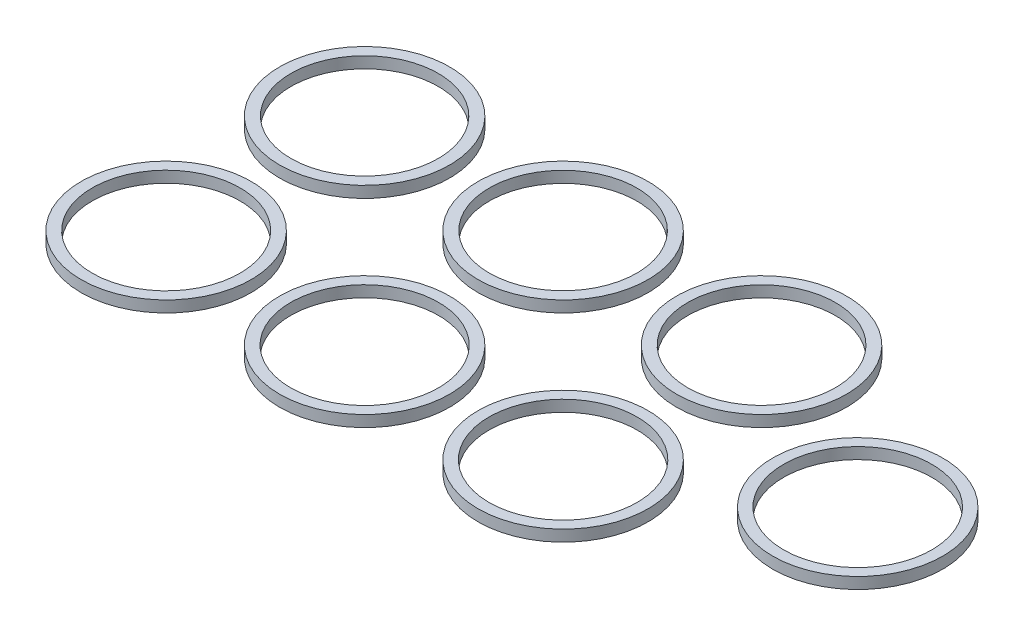
ISO-10303-21;
HEADER;
FILE_DESCRIPTION(('STEP AP214'),'2;1');
FILE_NAME('part.step','',(''),(''),'','','');
FILE_SCHEMA(('AUTOMOTIVE_DESIGN { 1 0 10303 214 1 1 1 1 }'));
ENDSEC;
DATA;
#1=APPLICATION_CONTEXT('core data for automotive mechanical design processes');
#2=APPLICATION_PROTOCOL_DEFINITION('international standard','automotive_design',2000,#1);
#3=PRODUCT_CONTEXT('',#1,'mechanical');
#4=PRODUCT('Part','Part','',(#3));
#5=PRODUCT_RELATED_PRODUCT_CATEGORY('part','',(#4));
#6=PRODUCT_DEFINITION_FORMATION('','',#4);
#7=PRODUCT_DEFINITION_CONTEXT('part definition',#1,'design');
#8=PRODUCT_DEFINITION('design','',#6,#7);
#9=PRODUCT_DEFINITION_SHAPE('','',#8);
#10=(LENGTH_UNIT() NAMED_UNIT(*) SI_UNIT(.MILLI.,.METRE.));
#11=(NAMED_UNIT(*) PLANE_ANGLE_UNIT() SI_UNIT($,.RADIAN.));
#12=(NAMED_UNIT(*) SI_UNIT($,.STERADIAN.) SOLID_ANGLE_UNIT());
#13=UNCERTAINTY_MEASURE_WITH_UNIT(LENGTH_MEASURE(1.E-05),#10,'distance_accuracy_value','');
#14=(GEOMETRIC_REPRESENTATION_CONTEXT(3) GLOBAL_UNCERTAINTY_ASSIGNED_CONTEXT((#13)) GLOBAL_UNIT_ASSIGNED_CONTEXT((#10,
#11,#12)) REPRESENTATION_CONTEXT('',''));
#15=CARTESIAN_POINT('',(0.,0.,0.));
#16=DIRECTION('',(0.,0.,1.));
#17=DIRECTION('',(1.,0.,0.));
#18=AXIS2_PLACEMENT_3D('',#15,#16,#17);
#19=CARTESIAN_POINT('',(206.424153942082,4.,32.5077407782806));
#20=DIRECTION('',(0.,1.,0.));
#21=DIRECTION('',(0.,0.,1.));
#22=AXIS2_PLACEMENT_3D('',#19,#20,#21);
#23=PLANE('',#22);
#24=CARTESIAN_POINT('',(206.424153942082,4.,32.5077407782806));
#25=DIRECTION('',(0.,1.,0.));
#26=DIRECTION('',(0.,0.,1.));
#27=AXIS2_PLACEMENT_3D('',#24,#25,#26);
#28=CIRCLE('',#27,30.);
#29=CARTESIAN_POINT('',(206.424153942082,4.,62.5077407782806));
#30=VERTEX_POINT('',#29);
#31=EDGE_CURVE('E65',#30,#30,#28,.T.);
#32=ORIENTED_EDGE('',*,*,#31,.T.);
#33=EDGE_LOOP('',(#32));
#34=FACE_BOUND('',#33,.T.);
#35=CARTESIAN_POINT('',(206.424153942082,4.,32.5077407782806));
#36=DIRECTION('',(0.,1.,0.));
#37=DIRECTION('',(0.,0.,1.));
#38=AXIS2_PLACEMENT_3D('',#35,#36,#37);
#39=CIRCLE('',#38,26.15);
#40=CARTESIAN_POINT('',(206.424153942082,4.,58.6577407782806));
#41=VERTEX_POINT('',#40);
#42=EDGE_CURVE('E56',#41,#41,#39,.T.);
#43=ORIENTED_EDGE('',*,*,#42,.F.);
#44=EDGE_LOOP('',(#43));
#45=FACE_BOUND('',#44,.T.);
#46=ADVANCED_FACE('F52',(#34,#45),#23,.T.);
#47=CARTESIAN_POINT('',(206.424153942082,0.,32.5077407782806));
#48=DIRECTION('',(0.,1.,0.));
#49=DIRECTION('',(0.,0.,1.));
#50=AXIS2_PLACEMENT_3D('',#47,#48,#49);
#51=PLANE('',#50);
#52=CARTESIAN_POINT('',(206.424153942082,0.,32.5077407782806));
#53=DIRECTION('',(0.,1.,0.));
#54=DIRECTION('',(0.,0.,1.));
#55=AXIS2_PLACEMENT_3D('',#52,#53,#54);
#56=CIRCLE('',#55,30.);
#57=CARTESIAN_POINT('',(206.424153942082,0.,62.5077407782806));
#58=VERTEX_POINT('',#57);
#59=EDGE_CURVE('E63',#58,#58,#56,.T.);
#60=ORIENTED_EDGE('',*,*,#59,.F.);
#61=EDGE_LOOP('',(#60));
#62=FACE_BOUND('',#61,.T.);
#63=CARTESIAN_POINT('',(206.424153942082,0.,32.5077407782806));
#64=DIRECTION('',(0.,1.,0.));
#65=DIRECTION('',(0.,0.,1.));
#66=AXIS2_PLACEMENT_3D('',#63,#64,#65);
#67=CIRCLE('',#66,26.15);
#68=CARTESIAN_POINT('',(206.424153942082,0.,58.6577407782806));
#69=VERTEX_POINT('',#68);
#70=EDGE_CURVE('E11',#69,#69,#67,.T.);
#71=ORIENTED_EDGE('',*,*,#70,.T.);
#72=EDGE_LOOP('',(#71));
#73=FACE_BOUND('',#72,.T.);
#74=ADVANCED_FACE('F73',(#62,#73),#51,.F.);
#75=CARTESIAN_POINT('',(206.424153942082,4.,32.5077407782806));
#76=DIRECTION('',(0.,-1.,0.));
#77=DIRECTION('',(0.,0.,-1.));
#78=AXIS2_PLACEMENT_3D('',#75,#76,#77);
#79=CYLINDRICAL_SURFACE('',#78,30.);
#80=ORIENTED_EDGE('',*,*,#31,.F.);
#81=EDGE_LOOP('',(#80));
#82=FACE_BOUND('',#81,.T.);
#83=ORIENTED_EDGE('',*,*,#59,.T.);
#84=EDGE_LOOP('',(#83));
#85=FACE_BOUND('',#84,.T.);
#86=ADVANCED_FACE('F71',(#82,#85),#79,.T.);
#87=CARTESIAN_POINT('',(206.424153942082,4.,32.5077407782806));
#88=DIRECTION('',(0.,-1.,0.));
#89=DIRECTION('',(0.,0.,-1.));
#90=AXIS2_PLACEMENT_3D('',#87,#88,#89);
#91=CYLINDRICAL_SURFACE('',#90,26.15);
#92=ORIENTED_EDGE('',*,*,#42,.T.);
#93=EDGE_LOOP('',(#92));
#94=FACE_BOUND('',#93,.T.);
#95=ORIENTED_EDGE('',*,*,#70,.F.);
#96=EDGE_LOOP('',(#95));
#97=FACE_BOUND('',#96,.T.);
#98=ADVANCED_FACE('F54',(#94,#97),#91,.F.);
#99=CLOSED_SHELL('',(#46,#74,#86,#98));
#100=MANIFOLD_SOLID_BREP('B2',#99);
#101=CARTESIAN_POINT('',(7.28924817360042E-13,4.,70.));
#102=DIRECTION('',(0.,1.,0.));
#103=DIRECTION('',(0.,0.,1.));
#104=AXIS2_PLACEMENT_3D('',#101,#102,#103);
#105=PLANE('',#104);
#106=CARTESIAN_POINT('',(7.28924817360042E-13,4.,70.));
#107=DIRECTION('',(0.,1.,0.));
#108=DIRECTION('',(0.,0.,1.));
#109=AXIS2_PLACEMENT_3D('',#106,#107,#108);
#110=CIRCLE('',#109,30.);
#111=CARTESIAN_POINT('',(7.28924817360042E-13,4.,100.));
#112=VERTEX_POINT('',#111);
#113=EDGE_CURVE('E135',#112,#112,#110,.T.);
#114=ORIENTED_EDGE('',*,*,#113,.T.);
#115=EDGE_LOOP('',(#114));
#116=FACE_BOUND('',#115,.T.);
#117=CARTESIAN_POINT('',(7.28924817360042E-13,4.,70.));
#118=DIRECTION('',(0.,1.,0.));
#119=DIRECTION('',(0.,0.,1.));
#120=AXIS2_PLACEMENT_3D('',#117,#118,#119);
#121=CIRCLE('',#120,26.075);
#122=CARTESIAN_POINT('',(7.28924817360042E-13,4.,96.075));
#123=VERTEX_POINT('',#122);
#124=EDGE_CURVE('E126',#123,#123,#121,.T.);
#125=ORIENTED_EDGE('',*,*,#124,.F.);
#126=EDGE_LOOP('',(#125));
#127=FACE_BOUND('',#126,.T.);
#128=ADVANCED_FACE('F122',(#116,#127),#105,.T.);
#129=CARTESIAN_POINT('',(7.28924817360042E-13,0.,70.));
#130=DIRECTION('',(0.,1.,0.));
#131=DIRECTION('',(0.,0.,1.));
#132=AXIS2_PLACEMENT_3D('',#129,#130,#131);
#133=PLANE('',#132);
#134=CARTESIAN_POINT('',(7.28924817360042E-13,0.,70.));
#135=DIRECTION('',(0.,1.,0.));
#136=DIRECTION('',(0.,0.,1.));
#137=AXIS2_PLACEMENT_3D('',#134,#135,#136);
#138=CIRCLE('',#137,30.);
#139=CARTESIAN_POINT('',(7.28924817360042E-13,0.,100.));
#140=VERTEX_POINT('',#139);
#141=EDGE_CURVE('E133',#140,#140,#138,.T.);
#142=ORIENTED_EDGE('',*,*,#141,.F.);
#143=EDGE_LOOP('',(#142));
#144=FACE_BOUND('',#143,.T.);
#145=CARTESIAN_POINT('',(7.28924817360042E-13,0.,70.));
#146=DIRECTION('',(0.,1.,0.));
#147=DIRECTION('',(0.,0.,1.));
#148=AXIS2_PLACEMENT_3D('',#145,#146,#147);
#149=CIRCLE('',#148,26.075);
#150=CARTESIAN_POINT('',(7.28924817360042E-13,0.,96.075));
#151=VERTEX_POINT('',#150);
#152=EDGE_CURVE('E51',#151,#151,#149,.T.);
#153=ORIENTED_EDGE('',*,*,#152,.T.);
#154=EDGE_LOOP('',(#153));
#155=FACE_BOUND('',#154,.T.);
#156=ADVANCED_FACE('F143',(#144,#155),#133,.F.);
#157=CARTESIAN_POINT('',(7.28924817360042E-13,4.,70.));
#158=DIRECTION('',(0.,-1.,0.));
#159=DIRECTION('',(0.,0.,-1.));
#160=AXIS2_PLACEMENT_3D('',#157,#158,#159);
#161=CYLINDRICAL_SURFACE('',#160,30.);
#162=ORIENTED_EDGE('',*,*,#113,.F.);
#163=EDGE_LOOP('',(#162));
#164=FACE_BOUND('',#163,.T.);
#165=ORIENTED_EDGE('',*,*,#141,.T.);
#166=EDGE_LOOP('',(#165));
#167=FACE_BOUND('',#166,.T.);
#168=ADVANCED_FACE('F141',(#164,#167),#161,.T.);
#169=CARTESIAN_POINT('',(7.28924817360042E-13,4.,70.));
#170=DIRECTION('',(0.,-1.,0.));
#171=DIRECTION('',(0.,0.,-1.));
#172=AXIS2_PLACEMENT_3D('',#169,#170,#171);
#173=CYLINDRICAL_SURFACE('',#172,26.075);
#174=ORIENTED_EDGE('',*,*,#124,.T.);
#175=EDGE_LOOP('',(#174));
#176=FACE_BOUND('',#175,.T.);
#177=ORIENTED_EDGE('',*,*,#152,.F.);
#178=EDGE_LOOP('',(#177));
#179=FACE_BOUND('',#178,.T.);
#180=ADVANCED_FACE('F124',(#176,#179),#173,.F.);
#181=CLOSED_SHELL('',(#128,#156,#168,#180));
#182=MANIFOLD_SOLID_BREP('B6',#181);
#183=CARTESIAN_POINT('',(140.000000000001,4.,70.));
#184=DIRECTION('',(0.,1.,0.));
#185=DIRECTION('',(0.,0.,1.));
#186=AXIS2_PLACEMENT_3D('',#183,#184,#185);
#187=PLANE('',#186);
#188=CARTESIAN_POINT('',(140.000000000001,4.,70.));
#189=DIRECTION('',(0.,1.,0.));
#190=DIRECTION('',(0.,0.,1.));
#191=AXIS2_PLACEMENT_3D('',#188,#189,#190);
#192=CIRCLE('',#191,30.);
#193=CARTESIAN_POINT('',(140.000000000001,4.,100.));
#194=VERTEX_POINT('',#193);
#195=EDGE_CURVE('E205',#194,#194,#192,.T.);
#196=ORIENTED_EDGE('',*,*,#195,.T.);
#197=EDGE_LOOP('',(#196));
#198=FACE_BOUND('',#197,.T.);
#199=CARTESIAN_POINT('',(140.000000000001,4.,70.));
#200=DIRECTION('',(0.,1.,0.));
#201=DIRECTION('',(0.,0.,1.));
#202=AXIS2_PLACEMENT_3D('',#199,#200,#201);
#203=CIRCLE('',#202,26.125);
#204=CARTESIAN_POINT('',(140.000000000001,4.,96.125));
#205=VERTEX_POINT('',#204);
#206=EDGE_CURVE('E196',#205,#205,#203,.T.);
#207=ORIENTED_EDGE('',*,*,#206,.F.);
#208=EDGE_LOOP('',(#207));
#209=FACE_BOUND('',#208,.T.);
#210=ADVANCED_FACE('F192',(#198,#209),#187,.T.);
#211=CARTESIAN_POINT('',(140.000000000001,0.,70.));
#212=DIRECTION('',(0.,1.,0.));
#213=DIRECTION('',(0.,0.,1.));
#214=AXIS2_PLACEMENT_3D('',#211,#212,#213);
#215=PLANE('',#214);
#216=CARTESIAN_POINT('',(140.000000000001,0.,70.));
#217=DIRECTION('',(0.,1.,0.));
#218=DIRECTION('',(0.,0.,1.));
#219=AXIS2_PLACEMENT_3D('',#216,#217,#218);
#220=CIRCLE('',#219,30.);
#221=CARTESIAN_POINT('',(140.000000000001,0.,100.));
#222=VERTEX_POINT('',#221);
#223=EDGE_CURVE('E203',#222,#222,#220,.T.);
#224=ORIENTED_EDGE('',*,*,#223,.F.);
#225=EDGE_LOOP('',(#224));
#226=FACE_BOUND('',#225,.T.);
#227=CARTESIAN_POINT('',(140.000000000001,0.,70.));
#228=DIRECTION('',(0.,1.,0.));
#229=DIRECTION('',(0.,0.,1.));
#230=AXIS2_PLACEMENT_3D('',#227,#228,#229);
#231=CIRCLE('',#230,26.125);
#232=CARTESIAN_POINT('',(140.000000000001,0.,96.125));
#233=VERTEX_POINT('',#232);
#234=EDGE_CURVE('E121',#233,#233,#231,.T.);
#235=ORIENTED_EDGE('',*,*,#234,.T.);
#236=EDGE_LOOP('',(#235));
#237=FACE_BOUND('',#236,.T.);
#238=ADVANCED_FACE('F213',(#226,#237),#215,.F.);
#239=CARTESIAN_POINT('',(140.000000000001,4.,70.));
#240=DIRECTION('',(0.,-1.,0.));
#241=DIRECTION('',(0.,0.,-1.));
#242=AXIS2_PLACEMENT_3D('',#239,#240,#241);
#243=CYLINDRICAL_SURFACE('',#242,30.);
#244=ORIENTED_EDGE('',*,*,#195,.F.);
#245=EDGE_LOOP('',(#244));
#246=FACE_BOUND('',#245,.T.);
#247=ORIENTED_EDGE('',*,*,#223,.T.);
#248=EDGE_LOOP('',(#247));
#249=FACE_BOUND('',#248,.T.);
#250=ADVANCED_FACE('F211',(#246,#249),#243,.T.);
#251=CARTESIAN_POINT('',(140.000000000001,4.,70.));
#252=DIRECTION('',(0.,-1.,0.));
#253=DIRECTION('',(0.,0.,-1.));
#254=AXIS2_PLACEMENT_3D('',#251,#252,#253);
#255=CYLINDRICAL_SURFACE('',#254,26.125);
#256=ORIENTED_EDGE('',*,*,#206,.T.);
#257=EDGE_LOOP('',(#256));
#258=FACE_BOUND('',#257,.T.);
#259=ORIENTED_EDGE('',*,*,#234,.F.);
#260=EDGE_LOOP('',(#259));
#261=FACE_BOUND('',#260,.T.);
#262=ADVANCED_FACE('F194',(#258,#261),#255,.F.);
#263=CLOSED_SHELL('',(#210,#238,#250,#262));
#264=MANIFOLD_SOLID_BREP('B46',#263);
#265=CARTESIAN_POINT('',(70.0000000000007,4.,70.));
#266=DIRECTION('',(0.,1.,0.));
#267=DIRECTION('',(0.,0.,1.));
#268=AXIS2_PLACEMENT_3D('',#265,#266,#267);
#269=PLANE('',#268);
#270=CARTESIAN_POINT('',(70.0000000000007,4.,70.));
#271=DIRECTION('',(0.,1.,0.));
#272=DIRECTION('',(0.,0.,1.));
#273=AXIS2_PLACEMENT_3D('',#270,#271,#272);
#274=CIRCLE('',#273,30.);
#275=CARTESIAN_POINT('',(70.0000000000007,4.,100.));
#276=VERTEX_POINT('',#275);
#277=EDGE_CURVE('E275',#276,#276,#274,.T.);
#278=ORIENTED_EDGE('',*,*,#277,.T.);
#279=EDGE_LOOP('',(#278));
#280=FACE_BOUND('',#279,.T.);
#281=CARTESIAN_POINT('',(70.0000000000007,4.,70.));
#282=DIRECTION('',(0.,1.,0.));
#283=DIRECTION('',(0.,0.,1.));
#284=AXIS2_PLACEMENT_3D('',#281,#282,#283);
#285=CIRCLE('',#284,26.1);
#286=CARTESIAN_POINT('',(70.0000000000007,4.,96.1));
#287=VERTEX_POINT('',#286);
#288=EDGE_CURVE('E266',#287,#287,#285,.T.);
#289=ORIENTED_EDGE('',*,*,#288,.F.);
#290=EDGE_LOOP('',(#289));
#291=FACE_BOUND('',#290,.T.);
#292=ADVANCED_FACE('F262',(#280,#291),#269,.T.);
#293=CARTESIAN_POINT('',(70.0000000000007,0.,70.));
#294=DIRECTION('',(0.,1.,0.));
#295=DIRECTION('',(0.,0.,1.));
#296=AXIS2_PLACEMENT_3D('',#293,#294,#295);
#297=PLANE('',#296);
#298=CARTESIAN_POINT('',(70.0000000000007,0.,70.));
#299=DIRECTION('',(0.,1.,0.));
#300=DIRECTION('',(0.,0.,1.));
#301=AXIS2_PLACEMENT_3D('',#298,#299,#300);
#302=CIRCLE('',#301,30.);
#303=CARTESIAN_POINT('',(70.0000000000007,0.,100.));
#304=VERTEX_POINT('',#303);
#305=EDGE_CURVE('E273',#304,#304,#302,.T.);
#306=ORIENTED_EDGE('',*,*,#305,.F.);
#307=EDGE_LOOP('',(#306));
#308=FACE_BOUND('',#307,.T.);
#309=CARTESIAN_POINT('',(70.0000000000007,0.,70.));
#310=DIRECTION('',(0.,1.,0.));
#311=DIRECTION('',(0.,0.,1.));
#312=AXIS2_PLACEMENT_3D('',#309,#310,#311);
#313=CIRCLE('',#312,26.1);
#314=CARTESIAN_POINT('',(70.0000000000007,0.,96.1));
#315=VERTEX_POINT('',#314);
#316=EDGE_CURVE('E191',#315,#315,#313,.T.);
#317=ORIENTED_EDGE('',*,*,#316,.T.);
#318=EDGE_LOOP('',(#317));
#319=FACE_BOUND('',#318,.T.);
#320=ADVANCED_FACE('F283',(#308,#319),#297,.F.);
#321=CARTESIAN_POINT('',(70.0000000000007,4.,70.));
#322=DIRECTION('',(0.,-1.,0.));
#323=DIRECTION('',(0.,0.,-1.));
#324=AXIS2_PLACEMENT_3D('',#321,#322,#323);
#325=CYLINDRICAL_SURFACE('',#324,30.);
#326=ORIENTED_EDGE('',*,*,#277,.F.);
#327=EDGE_LOOP('',(#326));
#328=FACE_BOUND('',#327,.T.);
#329=ORIENTED_EDGE('',*,*,#305,.T.);
#330=EDGE_LOOP('',(#329));
#331=FACE_BOUND('',#330,.T.);
#332=ADVANCED_FACE('F281',(#328,#331),#325,.T.);
#333=CARTESIAN_POINT('',(70.0000000000007,4.,70.));
#334=DIRECTION('',(0.,-1.,0.));
#335=DIRECTION('',(0.,0.,-1.));
#336=AXIS2_PLACEMENT_3D('',#333,#334,#335);
#337=CYLINDRICAL_SURFACE('',#336,26.1);
#338=ORIENTED_EDGE('',*,*,#288,.T.);
#339=EDGE_LOOP('',(#338));
#340=FACE_BOUND('',#339,.T.);
#341=ORIENTED_EDGE('',*,*,#316,.F.);
#342=EDGE_LOOP('',(#341));
#343=FACE_BOUND('',#342,.T.);
#344=ADVANCED_FACE('F264',(#340,#343),#337,.F.);
#345=CLOSED_SHELL('',(#292,#320,#332,#344));
#346=MANIFOLD_SOLID_BREP('B116',#345);
#347=CARTESIAN_POINT('',(140.,4.,0.));
#348=DIRECTION('',(0.,1.,0.));
#349=DIRECTION('',(0.,0.,1.));
#350=AXIS2_PLACEMENT_3D('',#347,#348,#349);
#351=PLANE('',#350);
#352=CARTESIAN_POINT('',(140.,4.,0.));
#353=DIRECTION('',(0.,1.,0.));
#354=DIRECTION('',(0.,0.,1.));
#355=AXIS2_PLACEMENT_3D('',#352,#353,#354);
#356=CIRCLE('',#355,30.);
#357=CARTESIAN_POINT('',(140.,4.,30.));
#358=VERTEX_POINT('',#357);
#359=EDGE_CURVE('E345',#358,#358,#356,.T.);
#360=ORIENTED_EDGE('',*,*,#359,.T.);
#361=EDGE_LOOP('',(#360));
#362=FACE_BOUND('',#361,.T.);
#363=CARTESIAN_POINT('',(140.,4.,0.));
#364=DIRECTION('',(0.,1.,0.));
#365=DIRECTION('',(0.,0.,1.));
#366=AXIS2_PLACEMENT_3D('',#363,#364,#365);
#367=CIRCLE('',#366,26.05);
#368=CARTESIAN_POINT('',(140.,4.,26.05));
#369=VERTEX_POINT('',#368);
#370=EDGE_CURVE('E336',#369,#369,#367,.T.);
#371=ORIENTED_EDGE('',*,*,#370,.F.);
#372=EDGE_LOOP('',(#371));
#373=FACE_BOUND('',#372,.T.);
#374=ADVANCED_FACE('F332',(#362,#373),#351,.T.);
#375=CARTESIAN_POINT('',(140.,0.,0.));
#376=DIRECTION('',(0.,1.,0.));
#377=DIRECTION('',(0.,0.,1.));
#378=AXIS2_PLACEMENT_3D('',#375,#376,#377);
#379=PLANE('',#378);
#380=CARTESIAN_POINT('',(140.,0.,0.));
#381=DIRECTION('',(0.,1.,0.));
#382=DIRECTION('',(0.,0.,1.));
#383=AXIS2_PLACEMENT_3D('',#380,#381,#382);
#384=CIRCLE('',#383,30.);
#385=CARTESIAN_POINT('',(140.,0.,30.));
#386=VERTEX_POINT('',#385);
#387=EDGE_CURVE('E343',#386,#386,#384,.T.);
#388=ORIENTED_EDGE('',*,*,#387,.F.);
#389=EDGE_LOOP('',(#388));
#390=FACE_BOUND('',#389,.T.);
#391=CARTESIAN_POINT('',(140.,0.,0.));
#392=DIRECTION('',(0.,1.,0.));
#393=DIRECTION('',(0.,0.,1.));
#394=AXIS2_PLACEMENT_3D('',#391,#392,#393);
#395=CIRCLE('',#394,26.05);
#396=CARTESIAN_POINT('',(140.,0.,26.05));
#397=VERTEX_POINT('',#396);
#398=EDGE_CURVE('E261',#397,#397,#395,.T.);
#399=ORIENTED_EDGE('',*,*,#398,.T.);
#400=EDGE_LOOP('',(#399));
#401=FACE_BOUND('',#400,.T.);
#402=ADVANCED_FACE('F353',(#390,#401),#379,.F.);
#403=CARTESIAN_POINT('',(140.,4.,0.));
#404=DIRECTION('',(0.,-1.,0.));
#405=DIRECTION('',(0.,0.,-1.));
#406=AXIS2_PLACEMENT_3D('',#403,#404,#405);
#407=CYLINDRICAL_SURFACE('',#406,30.);
#408=ORIENTED_EDGE('',*,*,#359,.F.);
#409=EDGE_LOOP('',(#408));
#410=FACE_BOUND('',#409,.T.);
#411=ORIENTED_EDGE('',*,*,#387,.T.);
#412=EDGE_LOOP('',(#411));
#413=FACE_BOUND('',#412,.T.);
#414=ADVANCED_FACE('F351',(#410,#413),#407,.T.);
#415=CARTESIAN_POINT('',(140.,4.,0.));
#416=DIRECTION('',(0.,-1.,0.));
#417=DIRECTION('',(0.,0.,-1.));
#418=AXIS2_PLACEMENT_3D('',#415,#416,#417);
#419=CYLINDRICAL_SURFACE('',#418,26.05);
#420=ORIENTED_EDGE('',*,*,#370,.T.);
#421=EDGE_LOOP('',(#420));
#422=FACE_BOUND('',#421,.T.);
#423=ORIENTED_EDGE('',*,*,#398,.F.);
#424=EDGE_LOOP('',(#423));
#425=FACE_BOUND('',#424,.T.);
#426=ADVANCED_FACE('F334',(#422,#425),#419,.F.);
#427=CLOSED_SHELL('',(#374,#402,#414,#426));
#428=MANIFOLD_SOLID_BREP('B186',#427);
#429=CARTESIAN_POINT('',(70.,4.,0.));
#430=DIRECTION('',(0.,1.,0.));
#431=DIRECTION('',(0.,0.,1.));
#432=AXIS2_PLACEMENT_3D('',#429,#430,#431);
#433=PLANE('',#432);
#434=CARTESIAN_POINT('',(70.,4.,0.));
#435=DIRECTION('',(0.,1.,0.));
#436=DIRECTION('',(0.,0.,1.));
#437=AXIS2_PLACEMENT_3D('',#434,#435,#436);
#438=CIRCLE('',#437,30.);
#439=CARTESIAN_POINT('',(70.,4.,30.));
#440=VERTEX_POINT('',#439);
#441=EDGE_CURVE('E414',#440,#440,#438,.T.);
#442=ORIENTED_EDGE('',*,*,#441,.T.);
#443=EDGE_LOOP('',(#442));
#444=FACE_BOUND('',#443,.T.);
#445=CARTESIAN_POINT('',(70.,4.,0.));
#446=DIRECTION('',(0.,1.,0.));
#447=DIRECTION('',(0.,0.,1.));
#448=AXIS2_PLACEMENT_3D('',#445,#446,#447);
#449=CIRCLE('',#448,26.025);
#450=CARTESIAN_POINT('',(70.,4.,26.025));
#451=VERTEX_POINT('',#450);
#452=EDGE_CURVE('E405',#451,#451,#449,.T.);
#453=ORIENTED_EDGE('',*,*,#452,.F.);
#454=EDGE_LOOP('',(#453));
#455=FACE_BOUND('',#454,.T.);
#456=ADVANCED_FACE('F401',(#444,#455),#433,.T.);
#457=CARTESIAN_POINT('',(70.,0.,0.));
#458=DIRECTION('',(0.,1.,0.));
#459=DIRECTION('',(0.,0.,1.));
#460=AXIS2_PLACEMENT_3D('',#457,#458,#459);
#461=PLANE('',#460);
#462=CARTESIAN_POINT('',(70.,0.,0.));
#463=DIRECTION('',(0.,1.,0.));
#464=DIRECTION('',(0.,0.,1.));
#465=AXIS2_PLACEMENT_3D('',#462,#463,#464);
#466=CIRCLE('',#465,30.);
#467=CARTESIAN_POINT('',(70.,0.,30.));
#468=VERTEX_POINT('',#467);
#469=EDGE_CURVE('E412',#468,#468,#466,.T.);
#470=ORIENTED_EDGE('',*,*,#469,.F.);
#471=EDGE_LOOP('',(#470));
#472=FACE_BOUND('',#471,.T.);
#473=CARTESIAN_POINT('',(70.,0.,0.));
#474=DIRECTION('',(0.,1.,0.));
#475=DIRECTION('',(0.,0.,1.));
#476=AXIS2_PLACEMENT_3D('',#473,#474,#475);
#477=CIRCLE('',#476,26.025);
#478=CARTESIAN_POINT('',(70.,0.,26.025));
#479=VERTEX_POINT('',#478);
#480=EDGE_CURVE('E331',#479,#479,#477,.T.);
#481=ORIENTED_EDGE('',*,*,#480,.T.);
#482=EDGE_LOOP('',(#481));
#483=FACE_BOUND('',#482,.T.);
#484=ADVANCED_FACE('F422',(#472,#483),#461,.F.);
#485=CARTESIAN_POINT('',(70.,4.,0.));
#486=DIRECTION('',(0.,-1.,0.));
#487=DIRECTION('',(0.,0.,-1.));
#488=AXIS2_PLACEMENT_3D('',#485,#486,#487);
#489=CYLINDRICAL_SURFACE('',#488,30.);
#490=ORIENTED_EDGE('',*,*,#441,.F.);
#491=EDGE_LOOP('',(#490));
#492=FACE_BOUND('',#491,.T.);
#493=ORIENTED_EDGE('',*,*,#469,.T.);
#494=EDGE_LOOP('',(#493));
#495=FACE_BOUND('',#494,.T.);
#496=ADVANCED_FACE('F420',(#492,#495),#489,.T.);
#497=CARTESIAN_POINT('',(70.,4.,0.));
#498=DIRECTION('',(0.,-1.,0.));
#499=DIRECTION('',(0.,0.,-1.));
#500=AXIS2_PLACEMENT_3D('',#497,#498,#499);
#501=CYLINDRICAL_SURFACE('',#500,26.025);
#502=ORIENTED_EDGE('',*,*,#452,.T.);
#503=EDGE_LOOP('',(#502));
#504=FACE_BOUND('',#503,.T.);
#505=ORIENTED_EDGE('',*,*,#480,.F.);
#506=EDGE_LOOP('',(#505));
#507=FACE_BOUND('',#506,.T.);
#508=ADVANCED_FACE('F403',(#504,#507),#501,.F.);
#509=CLOSED_SHELL('',(#456,#484,#496,#508));
#510=MANIFOLD_SOLID_BREP('B256',#509);
#511=CARTESIAN_POINT('',(0.,4.,0.));
#512=DIRECTION('',(0.,1.,0.));
#513=DIRECTION('',(0.,0.,1.));
#514=AXIS2_PLACEMENT_3D('',#511,#512,#513);
#515=PLANE('',#514);
#516=CARTESIAN_POINT('',(0.,4.,0.));
#517=DIRECTION('',(0.,1.,0.));
#518=DIRECTION('',(0.,0.,1.));
#519=AXIS2_PLACEMENT_3D('',#516,#517,#518);
#520=CIRCLE('',#519,30.);
#521=CARTESIAN_POINT('',(0.,4.,30.));
#522=VERTEX_POINT('',#521);
#523=EDGE_CURVE('E400',#522,#522,#520,.T.);
#524=ORIENTED_EDGE('',*,*,#523,.T.);
#525=EDGE_LOOP('',(#524));
#526=FACE_BOUND('',#525,.T.);
#527=CARTESIAN_POINT('',(0.,4.,0.));
#528=DIRECTION('',(0.,1.,0.));
#529=DIRECTION('',(0.,0.,1.));
#530=AXIS2_PLACEMENT_3D('',#527,#528,#529);
#531=CIRCLE('',#530,26.);
#532=CARTESIAN_POINT('',(0.,4.,26.));
#533=VERTEX_POINT('',#532);
#534=EDGE_CURVE('E476',#533,#533,#531,.T.);
#535=ORIENTED_EDGE('',*,*,#534,.F.);
#536=EDGE_LOOP('',(#535));
#537=FACE_BOUND('',#536,.T.);
#538=ADVANCED_FACE('F463',(#526,#537),#515,.T.);
#539=CARTESIAN_POINT('',(0.,0.,0.));
#540=DIRECTION('',(0.,1.,0.));
#541=DIRECTION('',(0.,0.,1.));
#542=AXIS2_PLACEMENT_3D('',#539,#540,#541);
#543=PLANE('',#542);
#544=CARTESIAN_POINT('',(0.,0.,0.));
#545=DIRECTION('',(0.,1.,0.));
#546=DIRECTION('',(0.,0.,1.));
#547=AXIS2_PLACEMENT_3D('',#544,#545,#546);
#548=CIRCLE('',#547,30.);
#549=CARTESIAN_POINT('',(0.,0.,30.));
#550=VERTEX_POINT('',#549);
#551=EDGE_CURVE('E467',#550,#550,#548,.T.);
#552=ORIENTED_EDGE('',*,*,#551,.F.);
#553=EDGE_LOOP('',(#552));
#554=FACE_BOUND('',#553,.T.);
#555=CARTESIAN_POINT('',(0.,0.,0.));
#556=DIRECTION('',(0.,1.,0.));
#557=DIRECTION('',(0.,0.,1.));
#558=AXIS2_PLACEMENT_3D('',#555,#556,#557);
#559=CIRCLE('',#558,26.);
#560=CARTESIAN_POINT('',(0.,0.,26.));
#561=VERTEX_POINT('',#560);
#562=EDGE_CURVE('E478',#561,#561,#559,.T.);
#563=ORIENTED_EDGE('',*,*,#562,.T.);
#564=EDGE_LOOP('',(#563));
#565=FACE_BOUND('',#564,.T.);
#566=ADVANCED_FACE('F490',(#554,#565),#543,.F.);
#567=CARTESIAN_POINT('',(0.,4.,0.));
#568=DIRECTION('',(0.,-1.,0.));
#569=DIRECTION('',(0.,0.,-1.));
#570=AXIS2_PLACEMENT_3D('',#567,#568,#569);
#571=CYLINDRICAL_SURFACE('',#570,30.);
#572=ORIENTED_EDGE('',*,*,#523,.F.);
#573=EDGE_LOOP('',(#572));
#574=FACE_BOUND('',#573,.T.);
#575=ORIENTED_EDGE('',*,*,#551,.T.);
#576=EDGE_LOOP('',(#575));
#577=FACE_BOUND('',#576,.T.);
#578=ADVANCED_FACE('F465',(#574,#577),#571,.T.);
#579=CARTESIAN_POINT('',(0.,4.,0.));
#580=DIRECTION('',(0.,-1.,0.));
#581=DIRECTION('',(0.,0.,-1.));
#582=AXIS2_PLACEMENT_3D('',#579,#580,#581);
#583=CYLINDRICAL_SURFACE('',#582,26.);
#584=ORIENTED_EDGE('',*,*,#534,.T.);
#585=EDGE_LOOP('',(#584));
#586=FACE_BOUND('',#585,.T.);
#587=ORIENTED_EDGE('',*,*,#562,.F.);
#588=EDGE_LOOP('',(#587));
#589=FACE_BOUND('',#588,.T.);
#590=ADVANCED_FACE('F486',(#586,#589),#583,.F.);
#591=CLOSED_SHELL('',(#538,#566,#578,#590));
#592=MANIFOLD_SOLID_BREP('B326',#591);
#593=ADVANCED_BREP_SHAPE_REPRESENTATION('',(#18,#100,#182,#264,#346,#428,#510,#592),#14);
#594=SHAPE_DEFINITION_REPRESENTATION(#9,#593);
ENDSEC;
END-ISO-10303-21;
